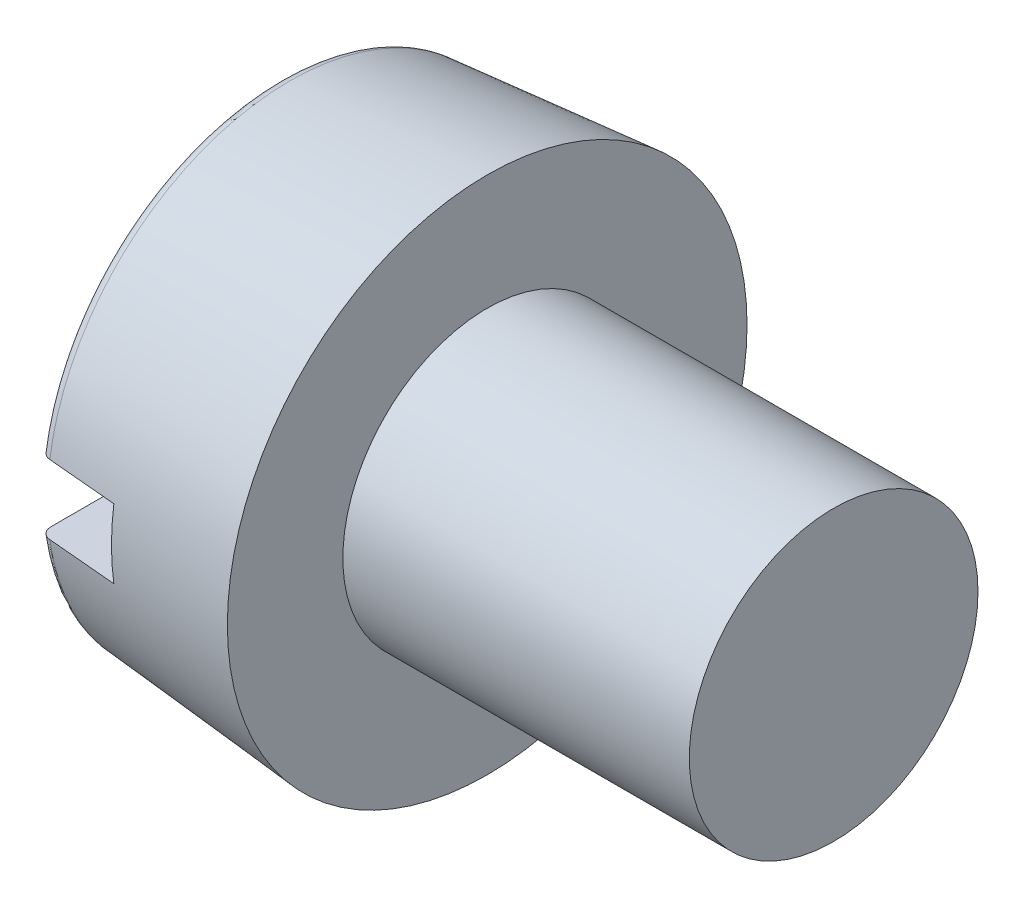
ISO-10303-21;
HEADER;
FILE_DESCRIPTION(('STEP AP214'),'2;1');
FILE_NAME('part.step','',(''),(''),'','','');
FILE_SCHEMA(('AUTOMOTIVE_DESIGN { 1 0 10303 214 1 1 1 1 }'));
ENDSEC;
DATA;
#1=APPLICATION_CONTEXT('core data for automotive mechanical design processes');
#2=APPLICATION_PROTOCOL_DEFINITION('international standard','automotive_design',2000,#1);
#3=PRODUCT_CONTEXT('',#1,'mechanical');
#4=PRODUCT('Part','Part','',(#3));
#5=PRODUCT_RELATED_PRODUCT_CATEGORY('part','',(#4));
#6=PRODUCT_DEFINITION_FORMATION('','',#4);
#7=PRODUCT_DEFINITION_CONTEXT('part definition',#1,'design');
#8=PRODUCT_DEFINITION('design','',#6,#7);
#9=PRODUCT_DEFINITION_SHAPE('','',#8);
#10=(LENGTH_UNIT() NAMED_UNIT(*) SI_UNIT(.MILLI.,.METRE.));
#11=(NAMED_UNIT(*) PLANE_ANGLE_UNIT() SI_UNIT($,.RADIAN.));
#12=(NAMED_UNIT(*) SI_UNIT($,.STERADIAN.) SOLID_ANGLE_UNIT());
#13=UNCERTAINTY_MEASURE_WITH_UNIT(LENGTH_MEASURE(1.E-05),#10,'distance_accuracy_value','');
#14=(GEOMETRIC_REPRESENTATION_CONTEXT(3) GLOBAL_UNCERTAINTY_ASSIGNED_CONTEXT((#13)) GLOBAL_UNIT_ASSIGNED_CONTEXT((#10,
#11,#12)) REPRESENTATION_CONTEXT('',''));
#15=CARTESIAN_POINT('',(0.,0.,0.));
#16=DIRECTION('',(0.,0.,1.));
#17=DIRECTION('',(1.,0.,0.));
#18=AXIS2_PLACEMENT_3D('',#15,#16,#17);
#19=CARTESIAN_POINT('',(0.7,0.3,2.25));
#20=DIRECTION('',(-1.,0.,0.));
#21=DIRECTION('',(0.,0.,-1.));
#22=AXIS2_PLACEMENT_3D('',#19,#20,#21);
#23=PLANE('',#22);
#24=DIRECTION('',(0.,0.,-1.));
#25=VECTOR('',#24,1.);
#26=CARTESIAN_POINT('',(0.7,0.3,-2.25));
#27=LINE('',#26,#25);
#28=CARTESIAN_POINT('',(0.699999999996865,0.3,-2.1327664611264));
#29=VERTEX_POINT('',#28);
#30=CARTESIAN_POINT('',(0.699999999997408,0.3,2.13276646112645));
#31=VERTEX_POINT('',#30);
#32=EDGE_CURVE('E94',#29,#31,#27,.F.);
#33=ORIENTED_EDGE('',*,*,#32,.F.);
#34=CARTESIAN_POINT('',(0.699999999994816,0.,0.));
#35=DIRECTION('',(-1.,0.,0.));
#36=DIRECTION('',(0.,1.,0.));
#37=AXIS2_PLACEMENT_3D('',#34,#35,#36);
#38=CIRCLE('',#37,2.15376247012173);
#39=CARTESIAN_POINT('',(0.699999999997408,-0.3,-2.13276646112645));
#40=VERTEX_POINT('',#39);
#41=EDGE_CURVE('E40',#40,#29,#38,.F.);
#42=ORIENTED_EDGE('',*,*,#41,.F.);
#43=DIRECTION('',(0.,0.,1.));
#44=VECTOR('',#43,1.);
#45=CARTESIAN_POINT('',(0.7,-0.3,2.25));
#46=LINE('',#45,#44);
#47=CARTESIAN_POINT('',(0.699999999996869,-0.3,2.1327664611264));
#48=VERTEX_POINT('',#47);
#49=EDGE_CURVE('E114',#48,#40,#46,.F.);
#50=ORIENTED_EDGE('',*,*,#49,.F.);
#51=CARTESIAN_POINT('',(0.699999999994816,0.,0.));
#52=DIRECTION('',(-1.,0.,0.));
#53=DIRECTION('',(0.,1.,0.));
#54=AXIS2_PLACEMENT_3D('',#51,#52,#53);
#55=CIRCLE('',#54,2.15376247012173);
#56=EDGE_CURVE('E109',#31,#48,#55,.F.);
#57=ORIENTED_EDGE('',*,*,#56,.F.);
#58=EDGE_LOOP('',(#33,#42,#50,#57));
#59=FACE_BOUND('',#58,.T.);
#60=ADVANCED_FACE('F37',(#59),#23,.T.);
#61=CARTESIAN_POINT('',(0.7,0.3,-2.25));
#62=DIRECTION('',(0.,1.,0.));
#63=DIRECTION('',(0.,0.,-1.));
#64=AXIS2_PLACEMENT_3D('',#61,#62,#63);
#65=PLANE('',#64);
#66=ORIENTED_EDGE('',*,*,#32,.T.);
#67=CARTESIAN_POINT('',(0.699999999998922,0.3,2.13276646112658));
#68=CARTESIAN_POINT('',(0.598547204527737,0.3,2.12380314092467));
#69=CARTESIAN_POINT('',(0.497094508935744,0.3,2.11483869051116));
#70=CARTESIAN_POINT('',(0.294189317509824,0.3,2.09690752926093));
#71=CARTESIAN_POINT('',(0.192736821675897,0.3,2.0879408184242));
#72=CARTESIAN_POINT('',(0.0912844257211611,0.3,2.07897297737588));
#73=B_SPLINE_CURVE_WITH_KNOTS('',3,(#67,#68,#69,#70,#71,#72),.UNSPECIFIED.,.F.,.F.,(4,2,4),(0.,
0.305543936819046,0.611087873639042),.UNSPECIFIED.);
#74=CARTESIAN_POINT('',(0.0912844257142166,0.3,2.07897297737634));
#75=VERTEX_POINT('',#74);
#76=EDGE_CURVE('E112',#31,#75,#73,.T.);
#77=ORIENTED_EDGE('',*,*,#76,.T.);
#78=CARTESIAN_POINT('',(0.0912844257211965,0.299999999999999,2.07897297737548));
#79=CARTESIAN_POINT('',(0.0857089496889276,0.300000000000277,2.07848006307191));
#80=CARTESIAN_POINT('',(0.0801856663583518,0.300000000000191,2.07751409442951));
#81=CARTESIAN_POINT('',(0.069384979774975,0.299999999999809,2.07467158740688));
#82=CARTESIAN_POINT('',(0.0641073197302588,0.299999999999515,2.07279602453516));
#83=CARTESIAN_POINT('',(0.0488695198902381,0.299999999999103,2.06586993593296));
#84=CARTESIAN_POINT('',(0.0394668369376314,0.299999999999452,2.05951636598393));
#85=CARTESIAN_POINT('',(0.023239108067874,0.299999999999772,2.0440575971808));
#86=CARTESIAN_POINT('',(0.0164282436767738,0.299999999999741,2.03493773671419));
#87=CARTESIAN_POINT('',(0.00610250085386032,0.299999999999711,2.01485202167284));
#88=CARTESIAN_POINT('',(0.00262216751419659,0.299999999999713,2.00386818176241));
#89=CARTESIAN_POINT('',(0.000333994214858043,0.299999999999855,1.98788580609055));
#90=CARTESIAN_POINT('',(-9.36557322318475E-06,0.299999999999915,1.98307252829008));
#91=CARTESIAN_POINT('',(0.,0.299999999999999,1.97826943066075));
#92=B_SPLINE_CURVE_WITH_KNOTS('',3,(#78,#79,#80,#81,#82,#83,#84,#85,#86,#87,#88,#89,#90,#91),
.UNSPECIFIED.,.F.,.F.,(4,2,2,2,2,2,4),(0.,0.0167515779570703,0.0334852300195741,
0.0668444199114797,0.100383601304344,0.134267005131862,0.148691565297055),.UNSPECIFIED.);
#93=CARTESIAN_POINT('',(0.,0.3,1.97826943066075));
#94=VERTEX_POINT('',#93);
#95=EDGE_CURVE('E291',#75,#94,#92,.T.);
#96=ORIENTED_EDGE('',*,*,#95,.T.);
#97=DIRECTION('',(0.,0.,-1.));
#98=VECTOR('',#97,1.);
#99=CARTESIAN_POINT('',(0.,0.3,0.));
#100=LINE('',#99,#98);
#101=CARTESIAN_POINT('',(0.,0.3,-1.97826943066075));
#102=VERTEX_POINT('',#101);
#103=EDGE_CURVE('E132',#94,#102,#100,.T.);
#104=ORIENTED_EDGE('',*,*,#103,.T.);
#105=CARTESIAN_POINT('',(0.,0.3,-1.97826943066075));
#106=CARTESIAN_POINT('',(7.61460550470829E-07,0.300000000000096,-1.98400903230242));
#107=CARTESIAN_POINT('',(0.000484412158471375,0.300000000000073,-1.98973842376891));
#108=CARTESIAN_POINT('',(0.00240088113519549,0.299999999999926,-2.00103369679977));
#109=CARTESIAN_POINT('',(0.00383333242928469,0.299999999999803,-2.00659964071478));
#110=CARTESIAN_POINT('',(0.00951760006137639,0.29999999999949,-2.02281044761265));
#111=CARTESIAN_POINT('',(0.0151565601521346,0.299999999999359,-2.03300619209606));
#112=CARTESIAN_POINT('',(0.0294662994366668,0.29999999999917,-2.0508560788851));
#113=CARTESIAN_POINT('',(0.0381197443878191,0.299999999999112,-2.05852427493714));
#114=CARTESIAN_POINT('',(0.0574313660479117,0.299999999998643,-2.07044289618804));
#115=CARTESIAN_POINT('',(0.0680677475058868,0.299999999998236,-2.07472805185054));
#116=CARTESIAN_POINT('',(0.0831015212104911,0.299999999999077,-2.07799598517875));
#117=CARTESIAN_POINT('',(0.0871850718020555,0.29999999999944,-2.07861813220356));
#118=CARTESIAN_POINT('',(0.091284425721759,0.3,-2.07897297737553));
#119=B_SPLINE_CURVE_WITH_KNOTS('',3,(#105,#106,#107,#108,#109,#110,#111,#112,#113,#114,#115,
#116,#117,#118),.UNSPECIFIED.,.F.,.F.,(4,2,2,2,2,2,4),(0.,0.0171784210670329,0.0343502016034068,
0.0685855989518334,0.102627295847003,0.136314801970286,0.148672334235728),.UNSPECIFIED.);
#120=CARTESIAN_POINT('',(0.0912844257145155,0.3,-2.07897297737617));
#121=VERTEX_POINT('',#120);
#122=EDGE_CURVE('E97',#102,#121,#119,.T.);
#123=ORIENTED_EDGE('',*,*,#122,.T.);
#124=CARTESIAN_POINT('',(0.0912844257217238,0.3,-2.07897297737593));
#125=CARTESIAN_POINT('',(0.192736821676364,0.3,-2.08794081842424));
#126=CARTESIAN_POINT('',(0.294189317510196,0.3,-2.09690752926096));
#127=CARTESIAN_POINT('',(0.497094508935926,0.3,-2.11483869051118));
#128=CARTESIAN_POINT('',(0.598547204527824,0.3,-2.12380314092468));
#129=CARTESIAN_POINT('',(0.699999999998913,0.3,-2.13276646112658));
#130=B_SPLINE_CURVE_WITH_KNOTS('',3,(#124,#125,#126,#127,#128,#129),.UNSPECIFIED.,.F.,.F.,(4,2,
4),(0.,0.305543936819709,0.611087873638469),.UNSPECIFIED.);
#131=EDGE_CURVE('E89',#121,#29,#130,.T.);
#132=ORIENTED_EDGE('',*,*,#131,.T.);
#133=EDGE_LOOP('',(#66,#77,#96,#104,#123,#132));
#134=FACE_BOUND('',#133,.T.);
#135=ADVANCED_FACE('F91',(#134),#65,.F.);
#136=CARTESIAN_POINT('',(0.7,-0.3,2.25));
#137=DIRECTION('',(0.,-1.,0.));
#138=DIRECTION('',(0.,0.,1.));
#139=AXIS2_PLACEMENT_3D('',#136,#137,#138);
#140=PLANE('',#139);
#141=CARTESIAN_POINT('',(0.,-0.3,1.97826943066075));
#142=CARTESIAN_POINT('',(7.61460550451757E-07,-0.300000000000096,1.98400903230242));
#143=CARTESIAN_POINT('',(0.000484412158471383,-0.300000000000073,1.98973842376891));
#144=CARTESIAN_POINT('',(0.00240088113519552,-0.299999999999926,2.00103369679977));
#145=CARTESIAN_POINT('',(0.00383333242928469,-0.299999999999803,2.00659964071478));
#146=CARTESIAN_POINT('',(0.00951760006137626,-0.299999999999491,2.02281044761265));
#147=CARTESIAN_POINT('',(0.0151565601521343,-0.299999999999359,2.03300619209606));
#148=CARTESIAN_POINT('',(0.0294662994366667,-0.29999999999917,2.0508560788851));
#149=CARTESIAN_POINT('',(0.0381197443878193,-0.299999999999112,2.05852427493714));
#150=CARTESIAN_POINT('',(0.057431366047912,-0.299999999998643,2.07044289618804));
#151=CARTESIAN_POINT('',(0.0680677475058868,-0.299999999998236,2.07472805185054));
#152=CARTESIAN_POINT('',(0.083101521210468,-0.299999999999077,2.07799598517874));
#153=CARTESIAN_POINT('',(0.0871850718020091,-0.29999999999944,2.07861813220355));
#154=CARTESIAN_POINT('',(0.0912844257216893,-0.299999999999999,2.07897297737553));
#155=B_SPLINE_CURVE_WITH_KNOTS('',3,(#141,#142,#143,#144,#145,#146,#147,#148,#149,#150,#151,
#152,#153,#154),.UNSPECIFIED.,.F.,.F.,(4,2,2,2,2,2,4),(0.,0.0171784210670329,0.0343502016034063,
0.0685855989518337,0.102627295847003,0.136314801970286,0.148672334235658),.UNSPECIFIED.);
#156=CARTESIAN_POINT('',(0.,-0.299999999999999,1.97826943066075));
#157=VERTEX_POINT('',#156);
#158=CARTESIAN_POINT('',(0.0912844257144807,-0.3,2.07897297737617));
#159=VERTEX_POINT('',#158);
#160=EDGE_CURVE('E133',#157,#159,#155,.T.);
#161=ORIENTED_EDGE('',*,*,#160,.T.);
#162=CARTESIAN_POINT('',(0.0912844257216541,-0.3,2.07897297737592));
#163=CARTESIAN_POINT('',(0.192736821676308,-0.3,2.08794081842424));
#164=CARTESIAN_POINT('',(0.294189317510152,-0.3,2.09690752926096));
#165=CARTESIAN_POINT('',(0.497094508935908,-0.3,2.11483869051118));
#166=CARTESIAN_POINT('',(0.59854720452782,-0.3,2.12380314092468));
#167=CARTESIAN_POINT('',(0.699999999998922,-0.3,2.13276646112658));
#168=B_SPLINE_CURVE_WITH_KNOTS('',3,(#162,#163,#164,#165,#166,#167),.UNSPECIFIED.,.F.,.F.,(4,2,
4),(0.,0.305543936819748,0.611087873638547),.UNSPECIFIED.);
#169=EDGE_CURVE('E125',#159,#48,#168,.T.);
#170=ORIENTED_EDGE('',*,*,#169,.T.);
#171=ORIENTED_EDGE('',*,*,#49,.T.);
#172=CARTESIAN_POINT('',(0.699999999998913,-0.3,-2.13276646112658));
#173=CARTESIAN_POINT('',(0.598547204527871,-0.3,-2.12380314092468));
#174=CARTESIAN_POINT('',(0.497094508936019,-0.3,-2.11483869051119));
#175=CARTESIAN_POINT('',(0.294189317510382,-0.3,-2.09690752926098));
#176=CARTESIAN_POINT('',(0.192736821676597,-0.3,-2.08794081842426));
#177=CARTESIAN_POINT('',(0.0912844257220034,-0.3,-2.07897297737595));
#178=B_SPLINE_CURVE_WITH_KNOTS('',3,(#172,#173,#174,#175,#176,#177),.UNSPECIFIED.,.F.,.F.,(4,2,
4),(0.,0.305543936818619,0.611087873638188),.UNSPECIFIED.);
#179=CARTESIAN_POINT('',(0.0912844257146377,-0.3,-2.07897297737638));
#180=VERTEX_POINT('',#179);
#181=EDGE_CURVE('E105',#40,#180,#178,.T.);
#182=ORIENTED_EDGE('',*,*,#181,.T.);
#183=CARTESIAN_POINT('',(0.0912844257220386,-0.3,-2.07897297737556));
#184=CARTESIAN_POINT('',(0.0857089496897662,-0.300000000000279,-2.07848006307203));
#185=CARTESIAN_POINT('',(0.080185666359183,-0.300000000000192,-2.07751409442968));
#186=CARTESIAN_POINT('',(0.0693849797757837,-0.299999999999809,-2.07467158740714));
#187=CARTESIAN_POINT('',(0.0641073197310524,-0.299999999999513,-2.07279602453547));
#188=CARTESIAN_POINT('',(0.0488695198909749,-0.299999999999101,-2.0658699359334));
#189=CARTESIAN_POINT('',(0.0394668369383152,-0.299999999999454,-2.05951636598445));
#190=CARTESIAN_POINT('',(0.023239108068429,-0.299999999999776,-2.04405759718146));
#191=CARTESIAN_POINT('',(0.0164282436772526,-0.299999999999743,-2.03493773671491));
#192=CARTESIAN_POINT('',(0.0061025008541712,-0.299999999999711,-2.01485202167365));
#193=CARTESIAN_POINT('',(0.00262216751441541,-0.299999999999712,-2.00386818176326));
#194=CARTESIAN_POINT('',(0.000333994214898562,-0.299999999999855,-1.98788580609113));
#195=CARTESIAN_POINT('',(-9.36557322447611E-06,-0.299999999999915,-1.98307252829037));
#196=CARTESIAN_POINT('',(0.,-0.299999999999999,-1.97826943066075));
#197=B_SPLINE_CURVE_WITH_KNOTS('',3,(#183,#184,#185,#186,#187,#188,#189,#190,#191,#192,#193,
#194,#195,#196),.UNSPECIFIED.,.F.,.F.,(4,2,2,2,2,2,4),(0.,0.0167515779570677,0.0334852300195688,
0.0668444199114694,0.100383601304326,0.134267005131835,0.148691565297898),.UNSPECIFIED.);
#198=CARTESIAN_POINT('',(0.,-0.300000000000001,-1.97826943066075));
#199=VERTEX_POINT('',#198);
#200=EDGE_CURVE('E161',#180,#199,#197,.T.);
#201=ORIENTED_EDGE('',*,*,#200,.T.);
#202=DIRECTION('',(0.,0.,-1.));
#203=VECTOR('',#202,1.);
#204=CARTESIAN_POINT('',(0.,-0.3,0.));
#205=LINE('',#204,#203);
#206=EDGE_CURVE('E188',#199,#157,#205,.F.);
#207=ORIENTED_EDGE('',*,*,#206,.T.);
#208=EDGE_LOOP('',(#161,#170,#171,#182,#201,#207));
#209=FACE_BOUND('',#208,.T.);
#210=ADVANCED_FACE('F138',(#209),#140,.F.);
#211=CARTESIAN_POINT('',(0.,0.,0.));
#212=DIRECTION('',(-1.,0.,0.));
#213=DIRECTION('',(0.,0.,-1.));
#214=AXIS2_PLACEMENT_3D('',#211,#212,#213);
#215=PLANE('',#214);
#216=ORIENTED_EDGE('',*,*,#103,.F.);
#217=CARTESIAN_POINT('',(0.,0.,0.));
#218=DIRECTION('',(1.,0.,0.));
#219=DIRECTION('',(0.,0.149933482891055,-0.988696086119571));
#220=AXIS2_PLACEMENT_3D('',#217,#218,#219);
#221=CIRCLE('',#220,2.00088728825159);
#222=EDGE_CURVE('E289',#94,#102,#221,.F.);
#223=ORIENTED_EDGE('',*,*,#222,.T.);
#224=EDGE_LOOP('',(#216,#223));
#225=FACE_BOUND('',#224,.T.);
#226=ADVANCED_FACE('F142',(#225),#215,.T.);
#227=CARTESIAN_POINT('',(0.,0.,0.));
#228=DIRECTION('',(-1.,0.,0.));
#229=DIRECTION('',(0.,0.,-1.));
#230=AXIS2_PLACEMENT_3D('',#227,#228,#229);
#231=PLANE('',#230);
#232=ORIENTED_EDGE('',*,*,#206,.F.);
#233=CARTESIAN_POINT('',(0.,0.,0.));
#234=DIRECTION('',(1.,0.,0.));
#235=DIRECTION('',(0.,-0.149933482891054,0.988696086119571));
#236=AXIS2_PLACEMENT_3D('',#233,#234,#235);
#237=CIRCLE('',#236,2.00088728825159);
#238=EDGE_CURVE('E55',#199,#157,#237,.F.);
#239=ORIENTED_EDGE('',*,*,#238,.T.);
#240=EDGE_LOOP('',(#232,#239));
#241=FACE_BOUND('',#240,.T.);
#242=ADVANCED_FACE('F190',(#241),#231,.T.);
#243=CARTESIAN_POINT('',(0.1,0.,0.));
#244=DIRECTION('',(-1.,0.,0.));
#245=DIRECTION('',(0.,0.,-1.));
#246=AXIS2_PLACEMENT_3D('',#243,#244,#245);
#247=TOROIDAL_SURFACE('',#246,2.00088728825159,0.1);
#248=ORIENTED_EDGE('',*,*,#122,.F.);
#249=ORIENTED_EDGE('',*,*,#222,.F.);
#250=ORIENTED_EDGE('',*,*,#95,.F.);
#251=CARTESIAN_POINT('',(0.091284425707272,0.,0.));
#252=DIRECTION('',(-1.,0.,0.));
#253=DIRECTION('',(0.,0.,1.));
#254=AXIS2_PLACEMENT_3D('',#251,#252,#253);
#255=CIRCLE('',#254,2.10050675806173);
#256=EDGE_CURVE('E178',#75,#121,#255,.T.);
#257=ORIENTED_EDGE('',*,*,#256,.T.);
#258=EDGE_LOOP('',(#248,#249,#250,#257));
#259=FACE_BOUND('',#258,.T.);
#260=ADVANCED_FACE('F170',(#259),#247,.T.);
#261=CARTESIAN_POINT('',(0.1,0.,0.));
#262=DIRECTION('',(-1.,0.,0.));
#263=DIRECTION('',(0.,0.,-1.));
#264=AXIS2_PLACEMENT_3D('',#261,#262,#263);
#265=TOROIDAL_SURFACE('',#264,2.00088728825159,0.1);
#266=ORIENTED_EDGE('',*,*,#200,.F.);
#267=CARTESIAN_POINT('',(0.091284425707272,0.,0.));
#268=DIRECTION('',(-1.,0.,0.));
#269=DIRECTION('',(0.,0.,1.));
#270=AXIS2_PLACEMENT_3D('',#267,#268,#269);
#271=CIRCLE('',#270,2.10050675806173);
#272=EDGE_CURVE('E124',#180,#159,#271,.T.);
#273=ORIENTED_EDGE('',*,*,#272,.T.);
#274=ORIENTED_EDGE('',*,*,#160,.F.);
#275=ORIENTED_EDGE('',*,*,#238,.F.);
#276=EDGE_LOOP('',(#266,#273,#274,#275));
#277=FACE_BOUND('',#276,.T.);
#278=ADVANCED_FACE('F165',(#277),#265,.T.);
#279=CARTESIAN_POINT('',(1.79999999994607,0.,0.));
#280=DIRECTION('',(1.,0.,0.));
#281=DIRECTION('',(0.,1.,0.));
#282=AXIS2_PLACEMENT_3D('',#279,#280,#281);
#283=CONICAL_SURFACE('',#282,2.24999999999653,0.0872664626002127);
#284=ORIENTED_EDGE('',*,*,#41,.T.);
#285=ORIENTED_EDGE('',*,*,#131,.F.);
#286=ORIENTED_EDGE('',*,*,#256,.F.);
#287=ORIENTED_EDGE('',*,*,#76,.F.);
#288=ORIENTED_EDGE('',*,*,#56,.T.);
#289=ORIENTED_EDGE('',*,*,#169,.F.);
#290=ORIENTED_EDGE('',*,*,#272,.F.);
#291=ORIENTED_EDGE('',*,*,#181,.F.);
#292=EDGE_LOOP('',(#284,#285,#286,#287,#288,#289,#290,#291));
#293=FACE_BOUND('',#292,.T.);
#294=CARTESIAN_POINT('',(1.80000000000291,0.,0.));
#295=DIRECTION('',(-1.,0.,0.));
#296=DIRECTION('',(0.,1.,0.));
#297=AXIS2_PLACEMENT_3D('',#294,#295,#296);
#298=CIRCLE('',#297,2.25000000000151);
#299=CARTESIAN_POINT('',(1.80000000000291,2.25000000000151,0.));
#300=VERTEX_POINT('',#299);
#301=EDGE_CURVE('E121',#300,#300,#298,.F.);
#302=ORIENTED_EDGE('',*,*,#301,.F.);
#303=EDGE_LOOP('',(#302));
#304=FACE_BOUND('',#303,.T.);
#305=ADVANCED_FACE('F102',(#293,#304),#283,.T.);
#306=CARTESIAN_POINT('',(4.8,1.25,0.));
#307=DIRECTION('',(1.,0.,0.));
#308=DIRECTION('',(0.,0.,1.));
#309=AXIS2_PLACEMENT_3D('',#306,#307,#308);
#310=PLANE('',#309);
#311=CARTESIAN_POINT('',(4.8,0.,0.));
#312=DIRECTION('',(1.,0.,0.));
#313=DIRECTION('',(0.,0.,-1.));
#314=AXIS2_PLACEMENT_3D('',#311,#312,#313);
#315=CIRCLE('',#314,1.25);
#316=CARTESIAN_POINT('',(4.8,0.,-1.25));
#317=VERTEX_POINT('',#316);
#318=EDGE_CURVE('E46',#317,#317,#315,.T.);
#319=ORIENTED_EDGE('',*,*,#318,.T.);
#320=EDGE_LOOP('',(#319));
#321=FACE_BOUND('',#320,.T.);
#322=ADVANCED_FACE('F243',(#321),#310,.T.);
#323=CARTESIAN_POINT('',(1.8,1.25,0.));
#324=DIRECTION('',(-1.,0.,0.));
#325=DIRECTION('',(0.,0.,-1.));
#326=AXIS2_PLACEMENT_3D('',#323,#324,#325);
#327=PLANE('',#326);
#328=CARTESIAN_POINT('',(1.8,0.,0.));
#329=DIRECTION('',(1.,0.,0.));
#330=DIRECTION('',(0.,0.,-1.));
#331=AXIS2_PLACEMENT_3D('',#328,#329,#330);
#332=CIRCLE('',#331,1.25);
#333=CARTESIAN_POINT('',(1.8,0.,-1.25));
#334=VERTEX_POINT('',#333);
#335=EDGE_CURVE('E11',#334,#334,#332,.F.);
#336=ORIENTED_EDGE('',*,*,#335,.T.);
#337=EDGE_LOOP('',(#336));
#338=FACE_BOUND('',#337,.T.);
#339=ORIENTED_EDGE('',*,*,#301,.T.);
#340=EDGE_LOOP('',(#339));
#341=FACE_BOUND('',#340,.T.);
#342=ADVANCED_FACE('F251',(#338,#341),#327,.F.);
#343=CARTESIAN_POINT('',(-25.4,0.,0.));
#344=DIRECTION('',(-1.,0.,0.));
#345=DIRECTION('',(0.,0.,-1.));
#346=AXIS2_PLACEMENT_3D('',#343,#344,#345);
#347=CYLINDRICAL_SURFACE('',#346,1.25);
#348=ORIENTED_EDGE('',*,*,#335,.F.);
#349=EDGE_LOOP('',(#348));
#350=FACE_BOUND('',#349,.T.);
#351=ORIENTED_EDGE('',*,*,#318,.F.);
#352=EDGE_LOOP('',(#351));
#353=FACE_BOUND('',#352,.T.);
#354=ADVANCED_FACE('F260',(#350,#353),#347,.T.);
#355=CLOSED_SHELL('',(#60,#135,#210,#226,#242,#260,#278,#305,#322,#342,#354));
#356=MANIFOLD_SOLID_BREP('B2',#355);
#357=ADVANCED_BREP_SHAPE_REPRESENTATION('',(#18,#356),#14);
#358=SHAPE_DEFINITION_REPRESENTATION(#9,#357);
ENDSEC;
END-ISO-10303-21;
